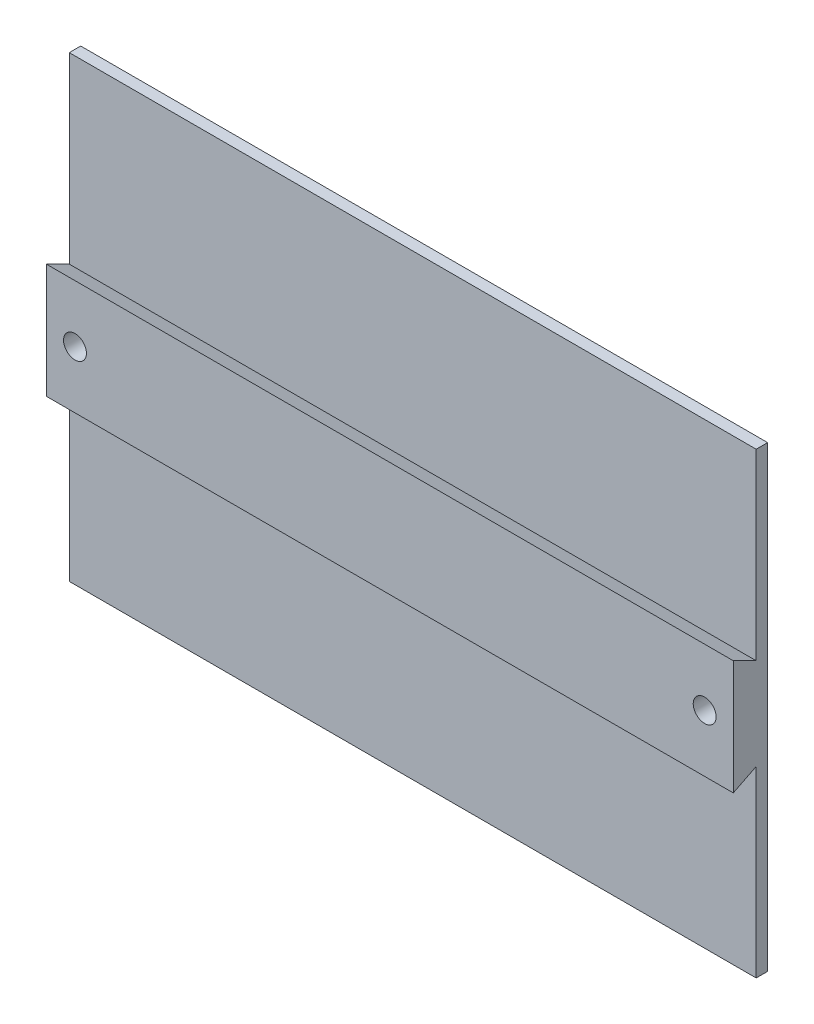
ISO-10303-21;
HEADER;
FILE_DESCRIPTION(('STEP AP214'),'2;1');
FILE_NAME('part.step','',(''),(''),'','','');
FILE_SCHEMA(('AUTOMOTIVE_DESIGN { 1 0 10303 214 1 1 1 1 }'));
ENDSEC;
DATA;
#1=APPLICATION_CONTEXT('core data for automotive mechanical design processes');
#2=APPLICATION_PROTOCOL_DEFINITION('international standard','automotive_design',2000,#1);
#3=PRODUCT_CONTEXT('',#1,'mechanical');
#4=PRODUCT('Part','Part','',(#3));
#5=PRODUCT_RELATED_PRODUCT_CATEGORY('part','',(#4));
#6=PRODUCT_DEFINITION_FORMATION('','',#4);
#7=PRODUCT_DEFINITION_CONTEXT('part definition',#1,'design');
#8=PRODUCT_DEFINITION('design','',#6,#7);
#9=PRODUCT_DEFINITION_SHAPE('','',#8);
#10=(LENGTH_UNIT() NAMED_UNIT(*) SI_UNIT(.MILLI.,.METRE.));
#11=(NAMED_UNIT(*) PLANE_ANGLE_UNIT() SI_UNIT($,.RADIAN.));
#12=(NAMED_UNIT(*) SI_UNIT($,.STERADIAN.) SOLID_ANGLE_UNIT());
#13=UNCERTAINTY_MEASURE_WITH_UNIT(LENGTH_MEASURE(1.E-05),#10,'distance_accuracy_value','');
#14=(GEOMETRIC_REPRESENTATION_CONTEXT(3) GLOBAL_UNCERTAINTY_ASSIGNED_CONTEXT((#13)) GLOBAL_UNIT_ASSIGNED_CONTEXT((#10,
#11,#12)) REPRESENTATION_CONTEXT('',''));
#15=CARTESIAN_POINT('',(0.,0.,0.));
#16=DIRECTION('',(0.,0.,1.));
#17=DIRECTION('',(1.,0.,0.));
#18=AXIS2_PLACEMENT_3D('',#15,#16,#17);
#19=CARTESIAN_POINT('',(-30.,0.,1.));
#20=DIRECTION('',(-1.,0.,0.));
#21=DIRECTION('',(0.,0.,1.));
#22=AXIS2_PLACEMENT_3D('',#19,#20,#21);
#23=PLANE('',#22);
#24=DIRECTION('',(0.,0.447213595499958,-0.894427190999916));
#25=VECTOR('',#24,1.);
#26=CARTESIAN_POINT('',(-30.,-3.2,-0.599999999999998));
#27=LINE('',#26,#25);
#28=CARTESIAN_POINT('',(-30.,-5.,3.));
#29=VERTEX_POINT('',#28);
#30=CARTESIAN_POINT('',(-30.,-4.,1.));
#31=VERTEX_POINT('',#30);
#32=EDGE_CURVE('E122',#29,#31,#27,.T.);
#33=ORIENTED_EDGE('',*,*,#32,.F.);
#34=DIRECTION('',(0.,1.,0.));
#35=VECTOR('',#34,1.);
#36=CARTESIAN_POINT('',(-30.,0.,3.));
#37=LINE('',#36,#35);
#38=CARTESIAN_POINT('',(-30.,5.,3.));
#39=VERTEX_POINT('',#38);
#40=EDGE_CURVE('E174',#29,#39,#37,.T.);
#41=ORIENTED_EDGE('',*,*,#40,.T.);
#42=DIRECTION('',(0.,0.447213595499958,0.894427190999916));
#43=VECTOR('',#42,1.);
#44=CARTESIAN_POINT('',(-30.,3.2,-0.600000000000002));
#45=LINE('',#44,#43);
#46=CARTESIAN_POINT('',(-30.,4.,1.));
#47=VERTEX_POINT('',#46);
#48=EDGE_CURVE('E124',#47,#39,#45,.T.);
#49=ORIENTED_EDGE('',*,*,#48,.F.);
#50=DIRECTION('',(0.,1.,0.));
#51=VECTOR('',#50,1.);
#52=CARTESIAN_POINT('',(-30.,0.,1.));
#53=LINE('',#52,#51);
#54=CARTESIAN_POINT('',(-30.,20.,1.));
#55=VERTEX_POINT('',#54);
#56=EDGE_CURVE('E150',#47,#55,#53,.T.);
#57=ORIENTED_EDGE('',*,*,#56,.T.);
#58=DIRECTION('',(0.,0.,-1.));
#59=VECTOR('',#58,1.);
#60=CARTESIAN_POINT('',(-30.,20.,1.));
#61=LINE('',#60,#59);
#62=CARTESIAN_POINT('',(-30.,20.,0.));
#63=VERTEX_POINT('',#62);
#64=EDGE_CURVE('E160',#55,#63,#61,.T.);
#65=ORIENTED_EDGE('',*,*,#64,.T.);
#66=DIRECTION('',(0.,1.,0.));
#67=VECTOR('',#66,1.);
#68=CARTESIAN_POINT('',(-30.,0.,0.));
#69=LINE('',#68,#67);
#70=CARTESIAN_POINT('',(-30.,-20.,0.));
#71=VERTEX_POINT('',#70);
#72=EDGE_CURVE('E183',#71,#63,#69,.T.);
#73=ORIENTED_EDGE('',*,*,#72,.F.);
#74=DIRECTION('',(0.,0.,-1.));
#75=VECTOR('',#74,1.);
#76=CARTESIAN_POINT('',(-30.,-20.,1.));
#77=LINE('',#76,#75);
#78=CARTESIAN_POINT('',(-30.,-20.,1.));
#79=VERTEX_POINT('',#78);
#80=EDGE_CURVE('E11',#79,#71,#77,.T.);
#81=ORIENTED_EDGE('',*,*,#80,.F.);
#82=DIRECTION('',(0.,1.,0.));
#83=VECTOR('',#82,1.);
#84=CARTESIAN_POINT('',(-30.,0.,1.));
#85=LINE('',#84,#83);
#86=EDGE_CURVE('E184',#79,#31,#85,.T.);
#87=ORIENTED_EDGE('',*,*,#86,.T.);
#88=EDGE_LOOP('',(#33,#41,#49,#57,#65,#73,#81,#87));
#89=FACE_BOUND('',#88,.T.);
#90=ADVANCED_FACE('F45',(#89),#23,.T.);
#91=CARTESIAN_POINT('',(0.,-20.,1.));
#92=DIRECTION('',(0.,-1.,0.));
#93=DIRECTION('',(0.,0.,-1.));
#94=AXIS2_PLACEMENT_3D('',#91,#92,#93);
#95=PLANE('',#94);
#96=DIRECTION('',(-1.,0.,0.));
#97=VECTOR('',#96,1.);
#98=CARTESIAN_POINT('',(0.,-20.,0.));
#99=LINE('',#98,#97);
#100=CARTESIAN_POINT('',(30.,-20.,0.));
#101=VERTEX_POINT('',#100);
#102=EDGE_CURVE('E192',#101,#71,#99,.T.);
#103=ORIENTED_EDGE('',*,*,#102,.F.);
#104=DIRECTION('',(0.,0.,-1.));
#105=VECTOR('',#104,1.);
#106=CARTESIAN_POINT('',(30.,-20.,1.));
#107=LINE('',#106,#105);
#108=CARTESIAN_POINT('',(30.,-20.,1.));
#109=VERTEX_POINT('',#108);
#110=EDGE_CURVE('E54',#109,#101,#107,.T.);
#111=ORIENTED_EDGE('',*,*,#110,.F.);
#112=DIRECTION('',(-1.,0.,0.));
#113=VECTOR('',#112,1.);
#114=CARTESIAN_POINT('',(0.,-20.,1.));
#115=LINE('',#114,#113);
#116=EDGE_CURVE('E115',#109,#79,#115,.T.);
#117=ORIENTED_EDGE('',*,*,#116,.T.);
#118=ORIENTED_EDGE('',*,*,#80,.T.);
#119=EDGE_LOOP('',(#103,#111,#117,#118));
#120=FACE_BOUND('',#119,.T.);
#121=ADVANCED_FACE('F203',(#120),#95,.T.);
#122=CARTESIAN_POINT('',(30.,0.,1.));
#123=DIRECTION('',(-1.,0.,0.));
#124=DIRECTION('',(0.,0.,1.));
#125=AXIS2_PLACEMENT_3D('',#122,#123,#124);
#126=PLANE('',#125);
#127=DIRECTION('',(0.,1.,0.));
#128=VECTOR('',#127,1.);
#129=CARTESIAN_POINT('',(30.,0.,3.));
#130=LINE('',#129,#128);
#131=CARTESIAN_POINT('',(30.,-5.,3.));
#132=VERTEX_POINT('',#131);
#133=CARTESIAN_POINT('',(30.,5.,3.));
#134=VERTEX_POINT('',#133);
#135=EDGE_CURVE('E130',#132,#134,#130,.T.);
#136=ORIENTED_EDGE('',*,*,#135,.F.);
#137=DIRECTION('',(0.,-0.447213595499958,0.894427190999916));
#138=VECTOR('',#137,1.);
#139=CARTESIAN_POINT('',(30.,-5.,3.));
#140=LINE('',#139,#138);
#141=CARTESIAN_POINT('',(30.,-4.,1.));
#142=VERTEX_POINT('',#141);
#143=EDGE_CURVE('E75',#142,#132,#140,.T.);
#144=ORIENTED_EDGE('',*,*,#143,.F.);
#145=DIRECTION('',(0.,1.,0.));
#146=VECTOR('',#145,1.);
#147=CARTESIAN_POINT('',(30.,0.,1.));
#148=LINE('',#147,#146);
#149=EDGE_CURVE('E111',#109,#142,#148,.T.);
#150=ORIENTED_EDGE('',*,*,#149,.F.);
#151=ORIENTED_EDGE('',*,*,#110,.T.);
#152=DIRECTION('',(0.,1.,0.));
#153=VECTOR('',#152,1.);
#154=CARTESIAN_POINT('',(30.,0.,0.));
#155=LINE('',#154,#153);
#156=CARTESIAN_POINT('',(30.,20.,0.));
#157=VERTEX_POINT('',#156);
#158=EDGE_CURVE('E187',#101,#157,#155,.T.);
#159=ORIENTED_EDGE('',*,*,#158,.T.);
#160=DIRECTION('',(0.,0.,-1.));
#161=VECTOR('',#160,1.);
#162=CARTESIAN_POINT('',(30.,20.,1.));
#163=LINE('',#162,#161);
#164=CARTESIAN_POINT('',(30.,20.,1.));
#165=VERTEX_POINT('',#164);
#166=EDGE_CURVE('E167',#165,#157,#163,.T.);
#167=ORIENTED_EDGE('',*,*,#166,.F.);
#168=DIRECTION('',(0.,1.,0.));
#169=VECTOR('',#168,1.);
#170=CARTESIAN_POINT('',(30.,0.,1.));
#171=LINE('',#170,#169);
#172=CARTESIAN_POINT('',(30.,4.,1.));
#173=VERTEX_POINT('',#172);
#174=EDGE_CURVE('E154',#173,#165,#171,.T.);
#175=ORIENTED_EDGE('',*,*,#174,.F.);
#176=DIRECTION('',(0.,-0.447213595499958,-0.894427190999916));
#177=VECTOR('',#176,1.);
#178=CARTESIAN_POINT('',(30.,4.,1.));
#179=LINE('',#178,#177);
#180=EDGE_CURVE('E132',#134,#173,#179,.T.);
#181=ORIENTED_EDGE('',*,*,#180,.F.);
#182=EDGE_LOOP('',(#136,#144,#150,#151,#159,#167,#175,#181));
#183=FACE_BOUND('',#182,.T.);
#184=ADVANCED_FACE('F127',(#183),#126,.F.);
#185=CARTESIAN_POINT('',(0.,0.,1.));
#186=DIRECTION('',(0.,0.,1.));
#187=DIRECTION('',(1.,0.,0.));
#188=AXIS2_PLACEMENT_3D('',#185,#186,#187);
#189=PLANE('',#188);
#190=ORIENTED_EDGE('',*,*,#149,.T.);
#191=DIRECTION('',(1.,0.,0.));
#192=VECTOR('',#191,1.);
#193=CARTESIAN_POINT('',(-36.,-4.,1.));
#194=LINE('',#193,#192);
#195=EDGE_CURVE('E114',#31,#142,#194,.T.);
#196=ORIENTED_EDGE('',*,*,#195,.F.);
#197=ORIENTED_EDGE('',*,*,#86,.F.);
#198=ORIENTED_EDGE('',*,*,#116,.F.);
#199=EDGE_LOOP('',(#190,#196,#197,#198));
#200=FACE_BOUND('',#199,.T.);
#201=ADVANCED_FACE('F112',(#200),#189,.T.);
#202=CARTESIAN_POINT('',(0.,0.,0.));
#203=DIRECTION('',(0.,0.,1.));
#204=DIRECTION('',(1.,0.,0.));
#205=AXIS2_PLACEMENT_3D('',#202,#203,#204);
#206=PLANE('',#205);
#207=CARTESIAN_POINT('',(-27.5,0.,0.));
#208=DIRECTION('',(0.,0.,1.));
#209=DIRECTION('',(1.,0.,0.));
#210=AXIS2_PLACEMENT_3D('',#207,#208,#209);
#211=CIRCLE('',#210,1.);
#212=CARTESIAN_POINT('',(-26.5,0.,0.));
#213=VERTEX_POINT('',#212);
#214=EDGE_CURVE('E139',#213,#213,#211,.T.);
#215=ORIENTED_EDGE('',*,*,#214,.T.);
#216=EDGE_LOOP('',(#215));
#217=FACE_BOUND('',#216,.T.);
#218=CARTESIAN_POINT('',(27.5,0.,0.));
#219=DIRECTION('',(0.,0.,1.));
#220=DIRECTION('',(1.,0.,0.));
#221=AXIS2_PLACEMENT_3D('',#218,#219,#220);
#222=CIRCLE('',#221,1.);
#223=CARTESIAN_POINT('',(28.5,0.,0.));
#224=VERTEX_POINT('',#223);
#225=EDGE_CURVE('E251',#224,#224,#222,.T.);
#226=ORIENTED_EDGE('',*,*,#225,.T.);
#227=EDGE_LOOP('',(#226));
#228=FACE_BOUND('',#227,.T.);
#229=ORIENTED_EDGE('',*,*,#72,.T.);
#230=DIRECTION('',(-1.,0.,0.));
#231=VECTOR('',#230,1.);
#232=CARTESIAN_POINT('',(0.,20.,0.));
#233=LINE('',#232,#231);
#234=EDGE_CURVE('E149',#157,#63,#233,.T.);
#235=ORIENTED_EDGE('',*,*,#234,.F.);
#236=ORIENTED_EDGE('',*,*,#158,.F.);
#237=ORIENTED_EDGE('',*,*,#102,.T.);
#238=EDGE_LOOP('',(#229,#235,#236,#237));
#239=FACE_BOUND('',#238,.T.);
#240=ADVANCED_FACE('F202',(#217,#228,#239),#206,.F.);
#241=CARTESIAN_POINT('',(0.,0.,3.));
#242=DIRECTION('',(0.,0.,1.));
#243=DIRECTION('',(1.,0.,0.));
#244=AXIS2_PLACEMENT_3D('',#241,#242,#243);
#245=PLANE('',#244);
#246=CARTESIAN_POINT('',(-27.5,0.,3.));
#247=DIRECTION('',(0.,0.,1.));
#248=DIRECTION('',(1.,0.,0.));
#249=AXIS2_PLACEMENT_3D('',#246,#247,#248);
#250=CIRCLE('',#249,1.);
#251=CARTESIAN_POINT('',(-26.5,0.,3.));
#252=VERTEX_POINT('',#251);
#253=EDGE_CURVE('E247',#252,#252,#250,.T.);
#254=ORIENTED_EDGE('',*,*,#253,.F.);
#255=EDGE_LOOP('',(#254));
#256=FACE_BOUND('',#255,.T.);
#257=CARTESIAN_POINT('',(27.5,0.,3.));
#258=DIRECTION('',(0.,0.,1.));
#259=DIRECTION('',(-1.,0.,0.));
#260=AXIS2_PLACEMENT_3D('',#257,#258,#259);
#261=CIRCLE('',#260,1.);
#262=CARTESIAN_POINT('',(26.5,0.,3.));
#263=VERTEX_POINT('',#262);
#264=EDGE_CURVE('E257',#263,#263,#261,.T.);
#265=ORIENTED_EDGE('',*,*,#264,.F.);
#266=EDGE_LOOP('',(#265));
#267=FACE_BOUND('',#266,.T.);
#268=DIRECTION('',(1.,0.,0.));
#269=VECTOR('',#268,1.);
#270=CARTESIAN_POINT('',(0.,5.,3.));
#271=LINE('',#270,#269);
#272=EDGE_CURVE('E171',#39,#134,#271,.T.);
#273=ORIENTED_EDGE('',*,*,#272,.F.);
#274=ORIENTED_EDGE('',*,*,#40,.F.);
#275=DIRECTION('',(1.,0.,0.));
#276=VECTOR('',#275,1.);
#277=CARTESIAN_POINT('',(0.,-5.,3.));
#278=LINE('',#277,#276);
#279=EDGE_CURVE('E178',#29,#132,#278,.T.);
#280=ORIENTED_EDGE('',*,*,#279,.T.);
#281=ORIENTED_EDGE('',*,*,#135,.T.);
#282=EDGE_LOOP('',(#273,#274,#280,#281));
#283=FACE_BOUND('',#282,.T.);
#284=ADVANCED_FACE('F215',(#256,#267,#283),#245,.T.);
#285=CARTESIAN_POINT('',(0.,20.,1.));
#286=DIRECTION('',(0.,-1.,0.));
#287=DIRECTION('',(0.,0.,-1.));
#288=AXIS2_PLACEMENT_3D('',#285,#286,#287);
#289=PLANE('',#288);
#290=ORIENTED_EDGE('',*,*,#234,.T.);
#291=ORIENTED_EDGE('',*,*,#64,.F.);
#292=DIRECTION('',(-1.,0.,0.));
#293=VECTOR('',#292,1.);
#294=CARTESIAN_POINT('',(0.,20.,1.));
#295=LINE('',#294,#293);
#296=EDGE_CURVE('E157',#165,#55,#295,.T.);
#297=ORIENTED_EDGE('',*,*,#296,.F.);
#298=ORIENTED_EDGE('',*,*,#166,.T.);
#299=EDGE_LOOP('',(#290,#291,#297,#298));
#300=FACE_BOUND('',#299,.T.);
#301=ADVANCED_FACE('F221',(#300),#289,.F.);
#302=CARTESIAN_POINT('',(0.,0.,1.));
#303=DIRECTION('',(0.,0.,1.));
#304=DIRECTION('',(1.,0.,0.));
#305=AXIS2_PLACEMENT_3D('',#302,#303,#304);
#306=PLANE('',#305);
#307=ORIENTED_EDGE('',*,*,#56,.F.);
#308=DIRECTION('',(1.,0.,0.));
#309=VECTOR('',#308,1.);
#310=CARTESIAN_POINT('',(-36.,4.,1.));
#311=LINE('',#310,#309);
#312=EDGE_CURVE('E136',#47,#173,#311,.T.);
#313=ORIENTED_EDGE('',*,*,#312,.T.);
#314=ORIENTED_EDGE('',*,*,#174,.T.);
#315=ORIENTED_EDGE('',*,*,#296,.T.);
#316=EDGE_LOOP('',(#307,#313,#314,#315));
#317=FACE_BOUND('',#316,.T.);
#318=ADVANCED_FACE('F224',(#317),#306,.T.);
#319=CARTESIAN_POINT('',(-36.,4.,1.));
#320=DIRECTION('',(0.,-0.894427190999916,0.447213595499958));
#321=DIRECTION('',(0.,-0.447213595499958,-0.894427190999916));
#322=AXIS2_PLACEMENT_3D('',#319,#320,#321);
#323=PLANE('',#322);
#324=ORIENTED_EDGE('',*,*,#48,.T.);
#325=ORIENTED_EDGE('',*,*,#272,.T.);
#326=ORIENTED_EDGE('',*,*,#180,.T.);
#327=ORIENTED_EDGE('',*,*,#312,.F.);
#328=EDGE_LOOP('',(#324,#325,#326,#327));
#329=FACE_BOUND('',#328,.T.);
#330=ADVANCED_FACE('F228',(#329),#323,.F.);
#331=CARTESIAN_POINT('',(-36.,-5.,3.));
#332=DIRECTION('',(0.,0.894427190999916,0.447213595499958));
#333=DIRECTION('',(0.,-0.447213595499958,0.894427190999916));
#334=AXIS2_PLACEMENT_3D('',#331,#332,#333);
#335=PLANE('',#334);
#336=ORIENTED_EDGE('',*,*,#32,.T.);
#337=ORIENTED_EDGE('',*,*,#195,.T.);
#338=ORIENTED_EDGE('',*,*,#143,.T.);
#339=ORIENTED_EDGE('',*,*,#279,.F.);
#340=EDGE_LOOP('',(#336,#337,#338,#339));
#341=FACE_BOUND('',#340,.T.);
#342=ADVANCED_FACE('F120',(#341),#335,.F.);
#343=CARTESIAN_POINT('',(27.5,0.,-7.));
#344=DIRECTION('',(0.,0.,1.));
#345=DIRECTION('',(1.,0.,0.));
#346=AXIS2_PLACEMENT_3D('',#343,#344,#345);
#347=CYLINDRICAL_SURFACE('',#346,1.);
#348=ORIENTED_EDGE('',*,*,#264,.T.);
#349=EDGE_LOOP('',(#348));
#350=FACE_BOUND('',#349,.T.);
#351=ORIENTED_EDGE('',*,*,#225,.F.);
#352=EDGE_LOOP('',(#351));
#353=FACE_BOUND('',#352,.T.);
#354=ADVANCED_FACE('F235',(#350,#353),#347,.F.);
#355=CARTESIAN_POINT('',(-27.5,0.,-7.));
#356=DIRECTION('',(0.,0.,1.));
#357=DIRECTION('',(1.,0.,0.));
#358=AXIS2_PLACEMENT_3D('',#355,#356,#357);
#359=CYLINDRICAL_SURFACE('',#358,1.);
#360=ORIENTED_EDGE('',*,*,#253,.T.);
#361=EDGE_LOOP('',(#360));
#362=FACE_BOUND('',#361,.T.);
#363=ORIENTED_EDGE('',*,*,#214,.F.);
#364=EDGE_LOOP('',(#363));
#365=FACE_BOUND('',#364,.T.);
#366=ADVANCED_FACE('F238',(#362,#365),#359,.F.);
#367=CLOSED_SHELL('',(#90,#121,#184,#201,#240,#284,#301,#318,#330,#342,#354,#366));
#368=MANIFOLD_SOLID_BREP('B2',#367);
#369=ADVANCED_BREP_SHAPE_REPRESENTATION('',(#18,#368),#14);
#370=SHAPE_DEFINITION_REPRESENTATION(#9,#369);
ENDSEC;
END-ISO-10303-21;
